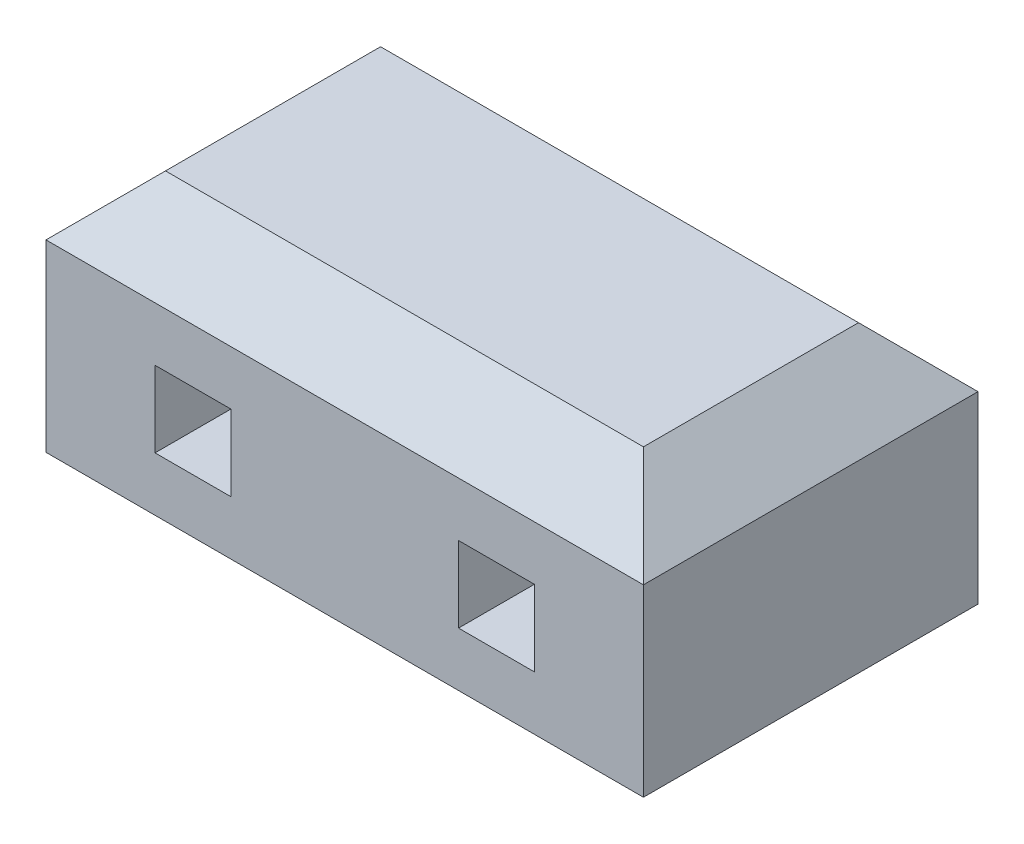
ISO-10303-21;
HEADER;
FILE_DESCRIPTION(('STEP AP214'),'2;1');
FILE_NAME('part.step','',(''),(''),'','','');
FILE_SCHEMA(('AUTOMOTIVE_DESIGN { 1 0 10303 214 1 1 1 1 }'));
ENDSEC;
DATA;
#1=APPLICATION_CONTEXT('core data for automotive mechanical design processes');
#2=APPLICATION_PROTOCOL_DEFINITION('international standard','automotive_design',2000,#1);
#3=PRODUCT_CONTEXT('',#1,'mechanical');
#4=PRODUCT('Part','Part','',(#3));
#5=PRODUCT_RELATED_PRODUCT_CATEGORY('part','',(#4));
#6=PRODUCT_DEFINITION_FORMATION('','',#4);
#7=PRODUCT_DEFINITION_CONTEXT('part definition',#1,'design');
#8=PRODUCT_DEFINITION('design','',#6,#7);
#9=PRODUCT_DEFINITION_SHAPE('','',#8);
#10=(LENGTH_UNIT() NAMED_UNIT(*) SI_UNIT(.MILLI.,.METRE.));
#11=(NAMED_UNIT(*) PLANE_ANGLE_UNIT() SI_UNIT($,.RADIAN.));
#12=(NAMED_UNIT(*) SI_UNIT($,.STERADIAN.) SOLID_ANGLE_UNIT());
#13=UNCERTAINTY_MEASURE_WITH_UNIT(LENGTH_MEASURE(1.E-05),#10,'distance_accuracy_value','');
#14=(GEOMETRIC_REPRESENTATION_CONTEXT(3) GLOBAL_UNCERTAINTY_ASSIGNED_CONTEXT((#13)) GLOBAL_UNIT_ASSIGNED_CONTEXT((#10,
#11,#12)) REPRESENTATION_CONTEXT('',''));
#15=CARTESIAN_POINT('',(0.,0.,0.));
#16=DIRECTION('',(0.,0.,1.));
#17=DIRECTION('',(1.,0.,0.));
#18=AXIS2_PLACEMENT_3D('',#15,#16,#17);
#19=CARTESIAN_POINT('',(-1.5875,-0.3175,3.698025612107));
#20=DIRECTION('',(1.,0.,0.));
#21=DIRECTION('',(0.,0.,-1.));
#22=AXIS2_PLACEMENT_3D('',#19,#20,#21);
#23=PLANE('',#22);
#24=DIRECTION('',(0.,0.,1.));
#25=VECTOR('',#24,1.);
#26=CARTESIAN_POINT('',(-1.5875,0.3175,3.698025612107));
#27=LINE('',#26,#25);
#28=CARTESIAN_POINT('',(-1.5875,0.3175,2.8));
#29=VERTEX_POINT('',#28);
#30=CARTESIAN_POINT('',(-1.5875,0.3175,0.));
#31=VERTEX_POINT('',#30);
#32=EDGE_CURVE('E166',#29,#31,#27,.F.);
#33=ORIENTED_EDGE('',*,*,#32,.F.);
#34=DIRECTION('',(0.,1.,0.));
#35=VECTOR('',#34,1.);
#36=CARTESIAN_POINT('',(-1.5875,-0.3175,2.8));
#37=LINE('',#36,#35);
#38=CARTESIAN_POINT('',(-1.5875,-0.3175,2.8));
#39=VERTEX_POINT('',#38);
#40=EDGE_CURVE('E126',#29,#39,#37,.F.);
#41=ORIENTED_EDGE('',*,*,#40,.T.);
#42=DIRECTION('',(0.,0.,1.));
#43=VECTOR('',#42,1.);
#44=CARTESIAN_POINT('',(-1.5875,-0.3175,3.698025612107));
#45=LINE('',#44,#43);
#46=CARTESIAN_POINT('',(-1.5875,-0.3175,0.));
#47=VERTEX_POINT('',#46);
#48=EDGE_CURVE('E151',#47,#39,#45,.T.);
#49=ORIENTED_EDGE('',*,*,#48,.F.);
#50=DIRECTION('',(0.,1.,0.));
#51=VECTOR('',#50,1.);
#52=CARTESIAN_POINT('',(-1.5875,-0.3175,0.));
#53=LINE('',#52,#51);
#54=EDGE_CURVE('E19',#47,#31,#53,.T.);
#55=ORIENTED_EDGE('',*,*,#54,.T.);
#56=EDGE_LOOP('',(#33,#41,#49,#55));
#57=FACE_BOUND('',#56,.T.);
#58=ADVANCED_FACE('F16',(#57),#23,.T.);
#59=CARTESIAN_POINT('',(-0.9525,-0.3175,3.698025612107));
#60=DIRECTION('',(-1.,0.,0.));
#61=DIRECTION('',(0.,0.,1.));
#62=AXIS2_PLACEMENT_3D('',#59,#60,#61);
#63=PLANE('',#62);
#64=DIRECTION('',(0.,0.,1.));
#65=VECTOR('',#64,1.);
#66=CARTESIAN_POINT('',(-0.9525,-0.3175,3.698025612107));
#67=LINE('',#66,#65);
#68=CARTESIAN_POINT('',(-0.9525,-0.3175,2.8));
#69=VERTEX_POINT('',#68);
#70=CARTESIAN_POINT('',(-0.9525,-0.3175,0.));
#71=VERTEX_POINT('',#70);
#72=EDGE_CURVE('E149',#69,#71,#67,.F.);
#73=ORIENTED_EDGE('',*,*,#72,.F.);
#74=DIRECTION('',(0.,1.,0.));
#75=VECTOR('',#74,1.);
#76=CARTESIAN_POINT('',(-0.9525,-0.3175,2.8));
#77=LINE('',#76,#75);
#78=CARTESIAN_POINT('',(-0.9525,0.3175,2.8));
#79=VERTEX_POINT('',#78);
#80=EDGE_CURVE('E132',#69,#79,#77,.T.);
#81=ORIENTED_EDGE('',*,*,#80,.T.);
#82=DIRECTION('',(0.,0.,1.));
#83=VECTOR('',#82,1.);
#84=CARTESIAN_POINT('',(-0.9525,0.3175,3.698025612107));
#85=LINE('',#84,#83);
#86=CARTESIAN_POINT('',(-0.9525,0.3175,0.));
#87=VERTEX_POINT('',#86);
#88=EDGE_CURVE('E173',#87,#79,#85,.T.);
#89=ORIENTED_EDGE('',*,*,#88,.F.);
#90=DIRECTION('',(0.,1.,0.));
#91=VECTOR('',#90,1.);
#92=CARTESIAN_POINT('',(-0.9525,-0.3175,0.));
#93=LINE('',#92,#91);
#94=EDGE_CURVE('E143',#87,#71,#93,.F.);
#95=ORIENTED_EDGE('',*,*,#94,.T.);
#96=EDGE_LOOP('',(#73,#81,#89,#95));
#97=FACE_BOUND('',#96,.T.);
#98=ADVANCED_FACE('F154',(#97),#63,.T.);
#99=CARTESIAN_POINT('',(0.9525,-0.3175,3.698025612107));
#100=DIRECTION('',(1.,0.,0.));
#101=DIRECTION('',(0.,0.,-1.));
#102=AXIS2_PLACEMENT_3D('',#99,#100,#101);
#103=PLANE('',#102);
#104=DIRECTION('',(0.,0.,1.));
#105=VECTOR('',#104,1.);
#106=CARTESIAN_POINT('',(0.9525,0.3175,3.698025612107));
#107=LINE('',#106,#105);
#108=CARTESIAN_POINT('',(0.9525,0.3175,2.8));
#109=VERTEX_POINT('',#108);
#110=CARTESIAN_POINT('',(0.9525,0.3175,0.));
#111=VERTEX_POINT('',#110);
#112=EDGE_CURVE('E195',#109,#111,#107,.F.);
#113=ORIENTED_EDGE('',*,*,#112,.F.);
#114=DIRECTION('',(0.,1.,0.));
#115=VECTOR('',#114,1.);
#116=CARTESIAN_POINT('',(0.9525,-0.3175,2.8));
#117=LINE('',#116,#115);
#118=CARTESIAN_POINT('',(0.9525,-0.3175,2.8));
#119=VERTEX_POINT('',#118);
#120=EDGE_CURVE('E162',#109,#119,#117,.F.);
#121=ORIENTED_EDGE('',*,*,#120,.T.);
#122=DIRECTION('',(0.,0.,1.));
#123=VECTOR('',#122,1.);
#124=CARTESIAN_POINT('',(0.9525,-0.3175,3.698025612107));
#125=LINE('',#124,#123);
#126=CARTESIAN_POINT('',(0.9525,-0.3175,0.));
#127=VERTEX_POINT('',#126);
#128=EDGE_CURVE('E211',#127,#119,#125,.T.);
#129=ORIENTED_EDGE('',*,*,#128,.F.);
#130=DIRECTION('',(0.,1.,0.));
#131=VECTOR('',#130,1.);
#132=CARTESIAN_POINT('',(0.9525,-0.3175,0.));
#133=LINE('',#132,#131);
#134=EDGE_CURVE('E142',#127,#111,#133,.T.);
#135=ORIENTED_EDGE('',*,*,#134,.T.);
#136=EDGE_LOOP('',(#113,#121,#129,#135));
#137=FACE_BOUND('',#136,.T.);
#138=ADVANCED_FACE('F302',(#137),#103,.T.);
#139=CARTESIAN_POINT('',(1.5875,-0.3175,3.698025612107));
#140=DIRECTION('',(-1.,0.,0.));
#141=DIRECTION('',(0.,0.,1.));
#142=AXIS2_PLACEMENT_3D('',#139,#140,#141);
#143=PLANE('',#142);
#144=DIRECTION('',(0.,0.,1.));
#145=VECTOR('',#144,1.);
#146=CARTESIAN_POINT('',(1.5875,-0.3175,3.698025612107));
#147=LINE('',#146,#145);
#148=CARTESIAN_POINT('',(1.5875,-0.3175,2.8));
#149=VERTEX_POINT('',#148);
#150=CARTESIAN_POINT('',(1.5875,-0.3175,0.));
#151=VERTEX_POINT('',#150);
#152=EDGE_CURVE('E214',#149,#151,#147,.F.);
#153=ORIENTED_EDGE('',*,*,#152,.F.);
#154=DIRECTION('',(0.,1.,0.));
#155=VECTOR('',#154,1.);
#156=CARTESIAN_POINT('',(1.5875,-0.3175,2.8));
#157=LINE('',#156,#155);
#158=CARTESIAN_POINT('',(1.5875,0.3175,2.8));
#159=VERTEX_POINT('',#158);
#160=EDGE_CURVE('E155',#149,#159,#157,.T.);
#161=ORIENTED_EDGE('',*,*,#160,.T.);
#162=DIRECTION('',(0.,0.,1.));
#163=VECTOR('',#162,1.);
#164=CARTESIAN_POINT('',(1.5875,0.3175,3.698025612107));
#165=LINE('',#164,#163);
#166=CARTESIAN_POINT('',(1.5875,0.3175,0.));
#167=VERTEX_POINT('',#166);
#168=EDGE_CURVE('E192',#167,#159,#165,.T.);
#169=ORIENTED_EDGE('',*,*,#168,.F.);
#170=DIRECTION('',(0.,1.,0.));
#171=VECTOR('',#170,1.);
#172=CARTESIAN_POINT('',(1.5875,-0.3175,0.));
#173=LINE('',#172,#171);
#174=EDGE_CURVE('E158',#167,#151,#173,.F.);
#175=ORIENTED_EDGE('',*,*,#174,.T.);
#176=EDGE_LOOP('',(#153,#161,#169,#175));
#177=FACE_BOUND('',#176,.T.);
#178=ADVANCED_FACE('F307',(#177),#143,.T.);
#179=CARTESIAN_POINT('',(-2.5,1.27,2.8));
#180=DIRECTION('',(0.,-1.,0.));
#181=DIRECTION('',(0.,0.,-1.));
#182=AXIS2_PLACEMENT_3D('',#179,#180,#181);
#183=PLANE('',#182);
#184=DIRECTION('',(0.,0.,1.));
#185=VECTOR('',#184,1.);
#186=CARTESIAN_POINT('',(-2.,1.27,2.8));
#187=LINE('',#186,#185);
#188=CARTESIAN_POINT('',(-2.,1.27,0.499999999999999));
#189=VERTEX_POINT('',#188);
#190=CARTESIAN_POINT('',(-2.,1.27,2.3));
#191=VERTEX_POINT('',#190);
#192=EDGE_CURVE('E174',#189,#191,#187,.T.);
#193=ORIENTED_EDGE('',*,*,#192,.T.);
#194=DIRECTION('',(1.,0.,0.));
#195=VECTOR('',#194,1.);
#196=CARTESIAN_POINT('',(-2.5,1.27,2.3));
#197=LINE('',#196,#195);
#198=CARTESIAN_POINT('',(2.,1.27,2.3));
#199=VERTEX_POINT('',#198);
#200=EDGE_CURVE('E198',#191,#199,#197,.T.);
#201=ORIENTED_EDGE('',*,*,#200,.T.);
#202=DIRECTION('',(0.,0.,1.));
#203=VECTOR('',#202,1.);
#204=CARTESIAN_POINT('',(2.,1.27,2.8));
#205=LINE('',#204,#203);
#206=CARTESIAN_POINT('',(2.,1.27,0.5));
#207=VERTEX_POINT('',#206);
#208=EDGE_CURVE('E183',#199,#207,#205,.F.);
#209=ORIENTED_EDGE('',*,*,#208,.T.);
#210=DIRECTION('',(1.,0.,0.));
#211=VECTOR('',#210,1.);
#212=CARTESIAN_POINT('',(-2.5,1.27,0.5));
#213=LINE('',#212,#211);
#214=EDGE_CURVE('E152',#189,#207,#213,.T.);
#215=ORIENTED_EDGE('',*,*,#214,.F.);
#216=EDGE_LOOP('',(#193,#201,#209,#215));
#217=FACE_BOUND('',#216,.T.);
#218=ADVANCED_FACE('F230',(#217),#183,.F.);
#219=CARTESIAN_POINT('',(-1.5875,-0.3175,3.698025612107));
#220=DIRECTION('',(0.,1.,0.));
#221=DIRECTION('',(-1.,0.,0.));
#222=AXIS2_PLACEMENT_3D('',#219,#220,#221);
#223=PLANE('',#222);
#224=ORIENTED_EDGE('',*,*,#48,.T.);
#225=DIRECTION('',(-1.,0.,0.));
#226=VECTOR('',#225,1.);
#227=CARTESIAN_POINT('',(-1.5875,-0.3175,2.8));
#228=LINE('',#227,#226);
#229=EDGE_CURVE('E135',#39,#69,#228,.F.);
#230=ORIENTED_EDGE('',*,*,#229,.T.);
#231=ORIENTED_EDGE('',*,*,#72,.T.);
#232=DIRECTION('',(-1.,0.,0.));
#233=VECTOR('',#232,1.);
#234=CARTESIAN_POINT('',(-2.5,-0.3175,0.));
#235=LINE('',#234,#233);
#236=EDGE_CURVE('E177',#47,#71,#235,.F.);
#237=ORIENTED_EDGE('',*,*,#236,.F.);
#238=EDGE_LOOP('',(#224,#230,#231,#237));
#239=FACE_BOUND('',#238,.T.);
#240=ADVANCED_FACE('F147',(#239),#223,.T.);
#241=CARTESIAN_POINT('',(-2.5,1.27,0.5));
#242=DIRECTION('',(0.,0.707106781186548,-0.707106781186548));
#243=DIRECTION('',(0.,0.707106781186548,0.707106781186548));
#244=AXIS2_PLACEMENT_3D('',#241,#242,#243);
#245=PLANE('',#244);
#246=DIRECTION('',(0.577350269189626,0.577350269189626,0.577350269189626));
#247=VECTOR('',#246,1.);
#248=CARTESIAN_POINT('',(-2.5,0.77,0.));
#249=LINE('',#248,#247);
#250=CARTESIAN_POINT('',(-2.5,0.77,0.));
#251=VERTEX_POINT('',#250);
#252=EDGE_CURVE('E205',#251,#189,#249,.T.);
#253=ORIENTED_EDGE('',*,*,#252,.T.);
#254=ORIENTED_EDGE('',*,*,#214,.T.);
#255=DIRECTION('',(0.577350269189626,-0.577350269189626,-0.577350269189626));
#256=VECTOR('',#255,1.);
#257=CARTESIAN_POINT('',(2.,1.27,0.499999999999999));
#258=LINE('',#257,#256);
#259=CARTESIAN_POINT('',(2.5,0.77,0.));
#260=VERTEX_POINT('',#259);
#261=EDGE_CURVE('E178',#207,#260,#258,.T.);
#262=ORIENTED_EDGE('',*,*,#261,.T.);
#263=DIRECTION('',(-1.,0.,0.));
#264=VECTOR('',#263,1.);
#265=CARTESIAN_POINT('',(-2.5,0.77,0.));
#266=LINE('',#265,#264);
#267=EDGE_CURVE('E180',#251,#260,#266,.F.);
#268=ORIENTED_EDGE('',*,*,#267,.F.);
#269=EDGE_LOOP('',(#253,#254,#262,#268));
#270=FACE_BOUND('',#269,.T.);
#271=ADVANCED_FACE('F219',(#270),#245,.T.);
#272=CARTESIAN_POINT('',(0.9525,-0.3175,3.698025612107));
#273=DIRECTION('',(0.,1.,0.));
#274=DIRECTION('',(-1.,0.,0.));
#275=AXIS2_PLACEMENT_3D('',#272,#273,#274);
#276=PLANE('',#275);
#277=ORIENTED_EDGE('',*,*,#128,.T.);
#278=DIRECTION('',(-1.,0.,0.));
#279=VECTOR('',#278,1.);
#280=CARTESIAN_POINT('',(0.9525,-0.3175,2.8));
#281=LINE('',#280,#279);
#282=EDGE_CURVE('E208',#119,#149,#281,.F.);
#283=ORIENTED_EDGE('',*,*,#282,.T.);
#284=ORIENTED_EDGE('',*,*,#152,.T.);
#285=DIRECTION('',(-1.,0.,0.));
#286=VECTOR('',#285,1.);
#287=CARTESIAN_POINT('',(-2.5,-0.3175,0.));
#288=LINE('',#287,#286);
#289=EDGE_CURVE('E265',#127,#151,#288,.F.);
#290=ORIENTED_EDGE('',*,*,#289,.F.);
#291=EDGE_LOOP('',(#277,#283,#284,#290));
#292=FACE_BOUND('',#291,.T.);
#293=ADVANCED_FACE('F309',(#292),#276,.T.);
#294=CARTESIAN_POINT('',(-2.5,0.77,2.8));
#295=DIRECTION('',(0.707106781186548,-0.707106781186548,0.));
#296=DIRECTION('',(0.707106781186548,0.707106781186548,0.));
#297=AXIS2_PLACEMENT_3D('',#294,#295,#296);
#298=PLANE('',#297);
#299=ORIENTED_EDGE('',*,*,#192,.F.);
#300=ORIENTED_EDGE('',*,*,#252,.F.);
#301=DIRECTION('',(0.,0.,-1.));
#302=VECTOR('',#301,1.);
#303=CARTESIAN_POINT('',(-2.5,0.77,2.8));
#304=LINE('',#303,#302);
#305=CARTESIAN_POINT('',(-2.5,0.77,2.8));
#306=VERTEX_POINT('',#305);
#307=EDGE_CURVE('E239',#251,#306,#304,.F.);
#308=ORIENTED_EDGE('',*,*,#307,.T.);
#309=DIRECTION('',(0.577350269189626,0.577350269189626,-0.577350269189626));
#310=VECTOR('',#309,1.);
#311=CARTESIAN_POINT('',(-2.5,0.77,2.8));
#312=LINE('',#311,#310);
#313=EDGE_CURVE('E200',#306,#191,#312,.T.);
#314=ORIENTED_EDGE('',*,*,#313,.T.);
#315=EDGE_LOOP('',(#299,#300,#308,#314));
#316=FACE_BOUND('',#315,.T.);
#317=ADVANCED_FACE('F237',(#316),#298,.F.);
#318=CARTESIAN_POINT('',(-1.5875,0.3175,3.698025612107));
#319=DIRECTION('',(0.,-1.,0.));
#320=DIRECTION('',(1.,0.,0.));
#321=AXIS2_PLACEMENT_3D('',#318,#319,#320);
#322=PLANE('',#321);
#323=ORIENTED_EDGE('',*,*,#88,.T.);
#324=DIRECTION('',(-1.,0.,0.));
#325=VECTOR('',#324,1.);
#326=CARTESIAN_POINT('',(-2.5,0.3175,2.8));
#327=LINE('',#326,#325);
#328=EDGE_CURVE('E137',#79,#29,#327,.T.);
#329=ORIENTED_EDGE('',*,*,#328,.T.);
#330=ORIENTED_EDGE('',*,*,#32,.T.);
#331=DIRECTION('',(-1.,0.,0.));
#332=VECTOR('',#331,1.);
#333=CARTESIAN_POINT('',(-2.5,0.3175,0.));
#334=LINE('',#333,#332);
#335=EDGE_CURVE('E172',#87,#31,#334,.T.);
#336=ORIENTED_EDGE('',*,*,#335,.F.);
#337=EDGE_LOOP('',(#323,#329,#330,#336));
#338=FACE_BOUND('',#337,.T.);
#339=ADVANCED_FACE('F171',(#338),#322,.T.);
#340=CARTESIAN_POINT('',(-2.5,0.77,2.8));
#341=DIRECTION('',(0.,-0.707106781186548,-0.707106781186548));
#342=DIRECTION('',(0.,0.707106781186548,-0.707106781186548));
#343=AXIS2_PLACEMENT_3D('',#340,#341,#342);
#344=PLANE('',#343);
#345=ORIENTED_EDGE('',*,*,#200,.F.);
#346=ORIENTED_EDGE('',*,*,#313,.F.);
#347=DIRECTION('',(-1.,0.,0.));
#348=VECTOR('',#347,1.);
#349=CARTESIAN_POINT('',(-2.5,0.77,2.8));
#350=LINE('',#349,#348);
#351=CARTESIAN_POINT('',(2.5,0.77,2.8));
#352=VERTEX_POINT('',#351);
#353=EDGE_CURVE('E248',#306,#352,#350,.F.);
#354=ORIENTED_EDGE('',*,*,#353,.T.);
#355=DIRECTION('',(-0.577350269189626,0.577350269189626,-0.577350269189626));
#356=VECTOR('',#355,1.);
#357=CARTESIAN_POINT('',(2.5,0.77,2.8));
#358=LINE('',#357,#356);
#359=EDGE_CURVE('E189',#352,#199,#358,.T.);
#360=ORIENTED_EDGE('',*,*,#359,.T.);
#361=EDGE_LOOP('',(#345,#346,#354,#360));
#362=FACE_BOUND('',#361,.T.);
#363=ADVANCED_FACE('F233',(#362),#344,.F.);
#364=CARTESIAN_POINT('',(0.9525,0.3175,3.698025612107));
#365=DIRECTION('',(0.,-1.,0.));
#366=DIRECTION('',(1.,0.,0.));
#367=AXIS2_PLACEMENT_3D('',#364,#365,#366);
#368=PLANE('',#367);
#369=ORIENTED_EDGE('',*,*,#168,.T.);
#370=DIRECTION('',(-1.,0.,0.));
#371=VECTOR('',#370,1.);
#372=CARTESIAN_POINT('',(-2.5,0.3175,2.8));
#373=LINE('',#372,#371);
#374=EDGE_CURVE('E253',#159,#109,#373,.T.);
#375=ORIENTED_EDGE('',*,*,#374,.T.);
#376=ORIENTED_EDGE('',*,*,#112,.T.);
#377=DIRECTION('',(-1.,0.,0.));
#378=VECTOR('',#377,1.);
#379=CARTESIAN_POINT('',(-2.5,0.3175,0.));
#380=LINE('',#379,#378);
#381=EDGE_CURVE('E268',#167,#111,#380,.T.);
#382=ORIENTED_EDGE('',*,*,#381,.F.);
#383=EDGE_LOOP('',(#369,#375,#376,#382));
#384=FACE_BOUND('',#383,.T.);
#385=ADVANCED_FACE('F294',(#384),#368,.T.);
#386=CARTESIAN_POINT('',(2.,1.27,2.8));
#387=DIRECTION('',(-0.707106781186548,-0.707106781186548,0.));
#388=DIRECTION('',(0.707106781186548,-0.707106781186548,0.));
#389=AXIS2_PLACEMENT_3D('',#386,#387,#388);
#390=PLANE('',#389);
#391=ORIENTED_EDGE('',*,*,#208,.F.);
#392=ORIENTED_EDGE('',*,*,#359,.F.);
#393=DIRECTION('',(0.,0.,1.));
#394=VECTOR('',#393,1.);
#395=CARTESIAN_POINT('',(2.5,0.77,2.8));
#396=LINE('',#395,#394);
#397=EDGE_CURVE('E229',#352,#260,#396,.F.);
#398=ORIENTED_EDGE('',*,*,#397,.T.);
#399=ORIENTED_EDGE('',*,*,#261,.F.);
#400=EDGE_LOOP('',(#391,#392,#398,#399));
#401=FACE_BOUND('',#400,.T.);
#402=ADVANCED_FACE('F227',(#401),#390,.F.);
#403=CARTESIAN_POINT('',(-2.5,1.27,0.));
#404=DIRECTION('',(0.,0.,-1.));
#405=DIRECTION('',(-1.,0.,0.));
#406=AXIS2_PLACEMENT_3D('',#403,#404,#405);
#407=PLANE('',#406);
#408=ORIENTED_EDGE('',*,*,#134,.F.);
#409=ORIENTED_EDGE('',*,*,#289,.T.);
#410=ORIENTED_EDGE('',*,*,#174,.F.);
#411=ORIENTED_EDGE('',*,*,#381,.T.);
#412=EDGE_LOOP('',(#408,#409,#410,#411));
#413=FACE_BOUND('',#412,.T.);
#414=DIRECTION('',(0.,1.,0.));
#415=VECTOR('',#414,1.);
#416=CARTESIAN_POINT('',(2.5,-1.27,0.));
#417=LINE('',#416,#415);
#418=CARTESIAN_POINT('',(2.5,-0.77,0.));
#419=VERTEX_POINT('',#418);
#420=EDGE_CURVE('E273',#260,#419,#417,.F.);
#421=ORIENTED_EDGE('',*,*,#420,.T.);
#422=DIRECTION('',(1.,0.,0.));
#423=VECTOR('',#422,1.);
#424=CARTESIAN_POINT('',(-2.5,-0.77,0.));
#425=LINE('',#424,#423);
#426=CARTESIAN_POINT('',(-2.5,-0.77,0.));
#427=VERTEX_POINT('',#426);
#428=EDGE_CURVE('E275',#427,#419,#425,.T.);
#429=ORIENTED_EDGE('',*,*,#428,.F.);
#430=DIRECTION('',(0.,1.,0.));
#431=VECTOR('',#430,1.);
#432=CARTESIAN_POINT('',(-2.5,-1.27,0.));
#433=LINE('',#432,#431);
#434=EDGE_CURVE('E244',#427,#251,#433,.T.);
#435=ORIENTED_EDGE('',*,*,#434,.T.);
#436=ORIENTED_EDGE('',*,*,#267,.T.);
#437=EDGE_LOOP('',(#421,#429,#435,#436));
#438=FACE_BOUND('',#437,.T.);
#439=ORIENTED_EDGE('',*,*,#54,.F.);
#440=ORIENTED_EDGE('',*,*,#236,.T.);
#441=ORIENTED_EDGE('',*,*,#94,.F.);
#442=ORIENTED_EDGE('',*,*,#335,.T.);
#443=EDGE_LOOP('',(#439,#440,#441,#442));
#444=FACE_BOUND('',#443,.T.);
#445=ADVANCED_FACE('F176',(#413,#438,#444),#407,.T.);
#446=CARTESIAN_POINT('',(-2.5,-1.27,2.8));
#447=DIRECTION('',(1.,0.,0.));
#448=DIRECTION('',(0.,0.,-1.));
#449=AXIS2_PLACEMENT_3D('',#446,#447,#448);
#450=PLANE('',#449);
#451=ORIENTED_EDGE('',*,*,#307,.F.);
#452=ORIENTED_EDGE('',*,*,#434,.F.);
#453=DIRECTION('',(0.,0.,1.));
#454=VECTOR('',#453,1.);
#455=CARTESIAN_POINT('',(-2.5,-0.77,2.8));
#456=LINE('',#455,#454);
#457=CARTESIAN_POINT('',(-2.5,-0.77,2.8));
#458=VERTEX_POINT('',#457);
#459=EDGE_CURVE('E258',#427,#458,#456,.T.);
#460=ORIENTED_EDGE('',*,*,#459,.T.);
#461=DIRECTION('',(0.,1.,0.));
#462=VECTOR('',#461,1.);
#463=CARTESIAN_POINT('',(-2.5,1.27,2.8));
#464=LINE('',#463,#462);
#465=EDGE_CURVE('E250',#458,#306,#464,.T.);
#466=ORIENTED_EDGE('',*,*,#465,.T.);
#467=EDGE_LOOP('',(#451,#452,#460,#466));
#468=FACE_BOUND('',#467,.T.);
#469=ADVANCED_FACE('F256',(#468),#450,.F.);
#470=CARTESIAN_POINT('',(-2.5,1.27,2.8));
#471=DIRECTION('',(0.,0.,-1.));
#472=DIRECTION('',(-1.,0.,0.));
#473=AXIS2_PLACEMENT_3D('',#470,#471,#472);
#474=PLANE('',#473);
#475=ORIENTED_EDGE('',*,*,#160,.F.);
#476=ORIENTED_EDGE('',*,*,#282,.F.);
#477=ORIENTED_EDGE('',*,*,#120,.F.);
#478=ORIENTED_EDGE('',*,*,#374,.F.);
#479=EDGE_LOOP('',(#475,#476,#477,#478));
#480=FACE_BOUND('',#479,.T.);
#481=ORIENTED_EDGE('',*,*,#353,.F.);
#482=ORIENTED_EDGE('',*,*,#465,.F.);
#483=DIRECTION('',(1.,0.,0.));
#484=VECTOR('',#483,1.);
#485=CARTESIAN_POINT('',(-2.5,-0.77,2.8));
#486=LINE('',#485,#484);
#487=CARTESIAN_POINT('',(2.5,-0.77,2.8));
#488=VERTEX_POINT('',#487);
#489=EDGE_CURVE('E284',#458,#488,#486,.T.);
#490=ORIENTED_EDGE('',*,*,#489,.T.);
#491=DIRECTION('',(0.,1.,0.));
#492=VECTOR('',#491,1.);
#493=CARTESIAN_POINT('',(2.5,-1.27,2.8));
#494=LINE('',#493,#492);
#495=EDGE_CURVE('E252',#488,#352,#494,.T.);
#496=ORIENTED_EDGE('',*,*,#495,.T.);
#497=EDGE_LOOP('',(#481,#482,#490,#496));
#498=FACE_BOUND('',#497,.T.);
#499=ORIENTED_EDGE('',*,*,#80,.F.);
#500=ORIENTED_EDGE('',*,*,#229,.F.);
#501=ORIENTED_EDGE('',*,*,#40,.F.);
#502=ORIENTED_EDGE('',*,*,#328,.F.);
#503=EDGE_LOOP('',(#499,#500,#501,#502));
#504=FACE_BOUND('',#503,.T.);
#505=ADVANCED_FACE('F134',(#480,#498,#504),#474,.F.);
#506=CARTESIAN_POINT('',(2.5,-1.27,2.8));
#507=DIRECTION('',(-1.,0.,0.));
#508=DIRECTION('',(0.,0.,1.));
#509=AXIS2_PLACEMENT_3D('',#506,#507,#508);
#510=PLANE('',#509);
#511=ORIENTED_EDGE('',*,*,#397,.F.);
#512=ORIENTED_EDGE('',*,*,#495,.F.);
#513=DIRECTION('',(0.,0.,1.));
#514=VECTOR('',#513,1.);
#515=CARTESIAN_POINT('',(2.5,-0.77,2.8));
#516=LINE('',#515,#514);
#517=EDGE_CURVE('E503',#488,#419,#516,.F.);
#518=ORIENTED_EDGE('',*,*,#517,.T.);
#519=ORIENTED_EDGE('',*,*,#420,.F.);
#520=EDGE_LOOP('',(#511,#512,#518,#519));
#521=FACE_BOUND('',#520,.T.);
#522=ADVANCED_FACE('F339',(#521),#510,.F.);
#523=CARTESIAN_POINT('',(-2.5,-1.27,0.5));
#524=DIRECTION('',(0.,-0.707106781186548,-0.707106781186548));
#525=DIRECTION('',(0.,0.707106781186548,-0.707106781186548));
#526=AXIS2_PLACEMENT_3D('',#523,#524,#525);
#527=PLANE('',#526);
#528=DIRECTION('',(-0.577350269189626,0.577350269189626,-0.577350269189626));
#529=VECTOR('',#528,1.);
#530=CARTESIAN_POINT('',(-2.,-1.27,0.499999999999999));
#531=LINE('',#530,#529);
#532=CARTESIAN_POINT('',(-2.,-1.27,0.5));
#533=VERTEX_POINT('',#532);
#534=EDGE_CURVE('E280',#533,#427,#531,.T.);
#535=ORIENTED_EDGE('',*,*,#534,.T.);
#536=ORIENTED_EDGE('',*,*,#428,.T.);
#537=DIRECTION('',(-0.577350269189626,-0.577350269189626,0.577350269189626));
#538=VECTOR('',#537,1.);
#539=CARTESIAN_POINT('',(2.5,-0.77,0.));
#540=LINE('',#539,#538);
#541=CARTESIAN_POINT('',(2.,-1.27,0.5));
#542=VERTEX_POINT('',#541);
#543=EDGE_CURVE('E504',#419,#542,#540,.T.);
#544=ORIENTED_EDGE('',*,*,#543,.T.);
#545=DIRECTION('',(1.,0.,0.));
#546=VECTOR('',#545,1.);
#547=CARTESIAN_POINT('',(-2.5,-1.27,0.5));
#548=LINE('',#547,#546);
#549=EDGE_CURVE('E507',#542,#533,#548,.F.);
#550=ORIENTED_EDGE('',*,*,#549,.T.);
#551=EDGE_LOOP('',(#535,#536,#544,#550));
#552=FACE_BOUND('',#551,.T.);
#553=ADVANCED_FACE('F336',(#552),#527,.T.);
#554=CARTESIAN_POINT('',(-2.,-1.27,2.8));
#555=DIRECTION('',(0.707106781186548,0.707106781186548,0.));
#556=DIRECTION('',(-0.707106781186548,0.707106781186548,0.));
#557=AXIS2_PLACEMENT_3D('',#554,#555,#556);
#558=PLANE('',#557);
#559=DIRECTION('',(0.,0.,1.));
#560=VECTOR('',#559,1.);
#561=CARTESIAN_POINT('',(-2.,-1.27,2.8));
#562=LINE('',#561,#560);
#563=CARTESIAN_POINT('',(-2.,-1.27,2.3));
#564=VERTEX_POINT('',#563);
#565=EDGE_CURVE('E513',#533,#564,#562,.T.);
#566=ORIENTED_EDGE('',*,*,#565,.T.);
#567=DIRECTION('',(-0.577350269189626,0.577350269189626,0.577350269189626));
#568=VECTOR('',#567,1.);
#569=CARTESIAN_POINT('',(-2.,-1.27,2.3));
#570=LINE('',#569,#568);
#571=EDGE_CURVE('E282',#564,#458,#570,.T.);
#572=ORIENTED_EDGE('',*,*,#571,.T.);
#573=ORIENTED_EDGE('',*,*,#459,.F.);
#574=ORIENTED_EDGE('',*,*,#534,.F.);
#575=EDGE_LOOP('',(#566,#572,#573,#574));
#576=FACE_BOUND('',#575,.T.);
#577=ADVANCED_FACE('F279',(#576),#558,.F.);
#578=CARTESIAN_POINT('',(-2.5,-0.77,2.8));
#579=DIRECTION('',(0.,0.707106781186548,-0.707106781186548));
#580=DIRECTION('',(0.,0.707106781186548,0.707106781186548));
#581=AXIS2_PLACEMENT_3D('',#578,#579,#580);
#582=PLANE('',#581);
#583=DIRECTION('',(1.,0.,0.));
#584=VECTOR('',#583,1.);
#585=CARTESIAN_POINT('',(-2.5,-1.27,2.3));
#586=LINE('',#585,#584);
#587=CARTESIAN_POINT('',(2.,-1.27,2.3));
#588=VERTEX_POINT('',#587);
#589=EDGE_CURVE('E25',#564,#588,#586,.T.);
#590=ORIENTED_EDGE('',*,*,#589,.T.);
#591=DIRECTION('',(0.577350269189626,0.577350269189626,0.577350269189626));
#592=VECTOR('',#591,1.);
#593=CARTESIAN_POINT('',(2.,-1.27,2.3));
#594=LINE('',#593,#592);
#595=EDGE_CURVE('E33',#588,#488,#594,.T.);
#596=ORIENTED_EDGE('',*,*,#595,.T.);
#597=ORIENTED_EDGE('',*,*,#489,.F.);
#598=ORIENTED_EDGE('',*,*,#571,.F.);
#599=EDGE_LOOP('',(#590,#596,#597,#598));
#600=FACE_BOUND('',#599,.T.);
#601=ADVANCED_FACE('F327',(#600),#582,.F.);
#602=CARTESIAN_POINT('',(2.5,-0.77,2.8));
#603=DIRECTION('',(-0.707106781186548,0.707106781186548,0.));
#604=DIRECTION('',(-0.707106781186548,-0.707106781186548,0.));
#605=AXIS2_PLACEMENT_3D('',#602,#603,#604);
#606=PLANE('',#605);
#607=ORIENTED_EDGE('',*,*,#517,.F.);
#608=ORIENTED_EDGE('',*,*,#595,.F.);
#609=DIRECTION('',(0.,0.,1.));
#610=VECTOR('',#609,1.);
#611=CARTESIAN_POINT('',(2.,-1.27,2.8));
#612=LINE('',#611,#610);
#613=EDGE_CURVE('E11',#588,#542,#612,.F.);
#614=ORIENTED_EDGE('',*,*,#613,.T.);
#615=ORIENTED_EDGE('',*,*,#543,.F.);
#616=EDGE_LOOP('',(#607,#608,#614,#615));
#617=FACE_BOUND('',#616,.T.);
#618=ADVANCED_FACE('F321',(#617),#606,.F.);
#619=CARTESIAN_POINT('',(-2.5,-1.27,2.8));
#620=DIRECTION('',(0.,1.,0.));
#621=DIRECTION('',(0.,0.,1.));
#622=AXIS2_PLACEMENT_3D('',#619,#620,#621);
#623=PLANE('',#622);
#624=ORIENTED_EDGE('',*,*,#589,.F.);
#625=ORIENTED_EDGE('',*,*,#565,.F.);
#626=ORIENTED_EDGE('',*,*,#549,.F.);
#627=ORIENTED_EDGE('',*,*,#613,.F.);
#628=EDGE_LOOP('',(#624,#625,#626,#627));
#629=FACE_BOUND('',#628,.T.);
#630=ADVANCED_FACE('F319',(#629),#623,.F.);
#631=CLOSED_SHELL('',(#58,#98,#138,#178,#218,#240,#271,#293,#317,#339,#363,#385,#402,#445,#469,
#505,#522,#553,#577,#601,#618,#630));
#632=MANIFOLD_SOLID_BREP('B1',#631);
#633=ADVANCED_BREP_SHAPE_REPRESENTATION('',(#18,#632),#14);
#634=SHAPE_DEFINITION_REPRESENTATION(#9,#633);
ENDSEC;
END-ISO-10303-21;
